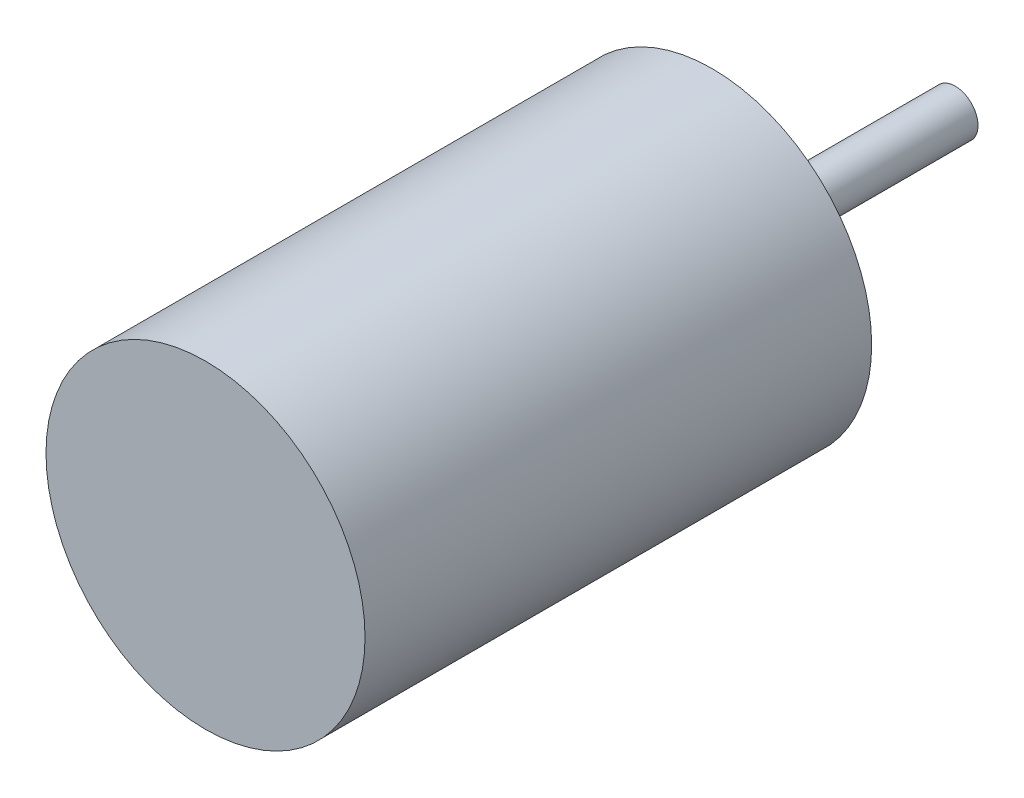
ISO-10303-21;
HEADER;
FILE_DESCRIPTION(('STEP AP214'),'2;1');
FILE_NAME('part.step','',(''),(''),'','','');
FILE_SCHEMA(('AUTOMOTIVE_DESIGN { 1 0 10303 214 1 1 1 1 }'));
ENDSEC;
DATA;
#1=APPLICATION_CONTEXT('core data for automotive mechanical design processes');
#2=APPLICATION_PROTOCOL_DEFINITION('international standard','automotive_design',2000,#1);
#3=PRODUCT_CONTEXT('',#1,'mechanical');
#4=PRODUCT('Part','Part','',(#3));
#5=PRODUCT_RELATED_PRODUCT_CATEGORY('part','',(#4));
#6=PRODUCT_DEFINITION_FORMATION('','',#4);
#7=PRODUCT_DEFINITION_CONTEXT('part definition',#1,'design');
#8=PRODUCT_DEFINITION('design','',#6,#7);
#9=PRODUCT_DEFINITION_SHAPE('','',#8);
#10=(LENGTH_UNIT() NAMED_UNIT(*) SI_UNIT(.MILLI.,.METRE.));
#11=(NAMED_UNIT(*) PLANE_ANGLE_UNIT() SI_UNIT($,.RADIAN.));
#12=(NAMED_UNIT(*) SI_UNIT($,.STERADIAN.) SOLID_ANGLE_UNIT());
#13=UNCERTAINTY_MEASURE_WITH_UNIT(LENGTH_MEASURE(1.E-05),#10,'distance_accuracy_value','');
#14=(GEOMETRIC_REPRESENTATION_CONTEXT(3) GLOBAL_UNCERTAINTY_ASSIGNED_CONTEXT((#13)) GLOBAL_UNIT_ASSIGNED_CONTEXT((#10,
#11,#12)) REPRESENTATION_CONTEXT('',''));
#15=CARTESIAN_POINT('',(0.,0.,0.));
#16=DIRECTION('',(0.,0.,1.));
#17=DIRECTION('',(1.,0.,0.));
#18=AXIS2_PLACEMENT_3D('',#15,#16,#17);
#19=CARTESIAN_POINT('',(0.,0.,32.));
#20=DIRECTION('',(0.,0.,-1.));
#21=DIRECTION('',(-1.,0.,0.));
#22=AXIS2_PLACEMENT_3D('',#19,#20,#21);
#23=CYLINDRICAL_SURFACE('',#22,3.);
#24=CARTESIAN_POINT('',(0.,0.,32.));
#25=DIRECTION('',(0.,0.,1.));
#26=DIRECTION('',(1.,0.,0.));
#27=AXIS2_PLACEMENT_3D('',#24,#25,#26);
#28=CIRCLE('',#27,3.);
#29=CARTESIAN_POINT('',(3.,0.,32.));
#30=VERTEX_POINT('',#29);
#31=EDGE_CURVE('E10',#30,#30,#28,.T.);
#32=ORIENTED_EDGE('',*,*,#31,.F.);
#33=EDGE_LOOP('',(#32));
#34=FACE_BOUND('',#33,.T.);
#35=CARTESIAN_POINT('',(0.,0.,0.));
#36=DIRECTION('',(0.,0.,1.));
#37=DIRECTION('',(1.,0.,0.));
#38=AXIS2_PLACEMENT_3D('',#35,#36,#37);
#39=CIRCLE('',#38,3.);
#40=CARTESIAN_POINT('',(3.,0.,0.));
#41=VERTEX_POINT('',#40);
#42=EDGE_CURVE('E34',#41,#41,#39,.T.);
#43=ORIENTED_EDGE('',*,*,#42,.T.);
#44=EDGE_LOOP('',(#43));
#45=FACE_BOUND('',#44,.T.);
#46=ADVANCED_FACE('F31',(#34,#45),#23,.T.);
#47=CARTESIAN_POINT('',(0.,0.,0.));
#48=DIRECTION('',(0.,0.,1.));
#49=DIRECTION('',(1.,0.,0.));
#50=AXIS2_PLACEMENT_3D('',#47,#48,#49);
#51=PLANE('',#50);
#52=ORIENTED_EDGE('',*,*,#42,.F.);
#53=EDGE_LOOP('',(#52));
#54=FACE_BOUND('',#53,.T.);
#55=ADVANCED_FACE('F54',(#54),#51,.F.);
#56=CARTESIAN_POINT('',(0.,0.,98.7));
#57=DIRECTION('',(0.,0.,-1.));
#58=DIRECTION('',(-1.,0.,0.));
#59=AXIS2_PLACEMENT_3D('',#56,#57,#58);
#60=CYLINDRICAL_SURFACE('',#59,21.);
#61=CARTESIAN_POINT('',(0.,0.,98.7));
#62=DIRECTION('',(0.,0.,1.));
#63=DIRECTION('',(1.,0.,0.));
#64=AXIS2_PLACEMENT_3D('',#61,#62,#63);
#65=CIRCLE('',#64,21.);
#66=CARTESIAN_POINT('',(21.,0.,98.7));
#67=VERTEX_POINT('',#66);
#68=EDGE_CURVE('E41',#67,#67,#65,.T.);
#69=ORIENTED_EDGE('',*,*,#68,.F.);
#70=EDGE_LOOP('',(#69));
#71=FACE_BOUND('',#70,.T.);
#72=CARTESIAN_POINT('',(0.,0.,32.));
#73=DIRECTION('',(0.,0.,1.));
#74=DIRECTION('',(1.,0.,0.));
#75=AXIS2_PLACEMENT_3D('',#72,#73,#74);
#76=CIRCLE('',#75,21.);
#77=CARTESIAN_POINT('',(21.,0.,32.));
#78=VERTEX_POINT('',#77);
#79=EDGE_CURVE('E43',#78,#78,#76,.T.);
#80=ORIENTED_EDGE('',*,*,#79,.T.);
#81=EDGE_LOOP('',(#80));
#82=FACE_BOUND('',#81,.T.);
#83=ADVANCED_FACE('F51',(#71,#82),#60,.T.);
#84=CARTESIAN_POINT('',(0.,0.,98.7));
#85=DIRECTION('',(0.,0.,1.));
#86=DIRECTION('',(1.,0.,0.));
#87=AXIS2_PLACEMENT_3D('',#84,#85,#86);
#88=PLANE('',#87);
#89=ORIENTED_EDGE('',*,*,#68,.T.);
#90=EDGE_LOOP('',(#89));
#91=FACE_BOUND('',#90,.T.);
#92=ADVANCED_FACE('F49',(#91),#88,.T.);
#93=CARTESIAN_POINT('',(0.,0.,32.));
#94=DIRECTION('',(0.,0.,1.));
#95=DIRECTION('',(1.,0.,0.));
#96=AXIS2_PLACEMENT_3D('',#93,#94,#95);
#97=PLANE('',#96);
#98=ORIENTED_EDGE('',*,*,#31,.T.);
#99=EDGE_LOOP('',(#98));
#100=FACE_BOUND('',#99,.T.);
#101=ORIENTED_EDGE('',*,*,#79,.F.);
#102=EDGE_LOOP('',(#101));
#103=FACE_BOUND('',#102,.T.);
#104=ADVANCED_FACE('F58',(#100,#103),#97,.F.);
#105=CLOSED_SHELL('',(#46,#55,#83,#92,#104));
#106=MANIFOLD_SOLID_BREP('B2',#105);
#107=ADVANCED_BREP_SHAPE_REPRESENTATION('',(#18,#106),#14);
#108=SHAPE_DEFINITION_REPRESENTATION(#9,#107);
ENDSEC;
END-ISO-10303-21;
